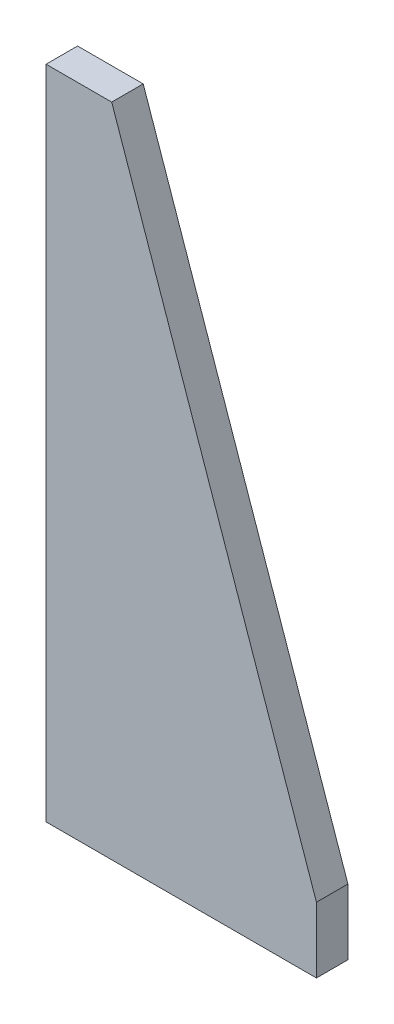
ISO-10303-21;
HEADER;
FILE_DESCRIPTION(('STEP AP214'),'2;1');
FILE_NAME('part.step','',(''),(''),'','','');
FILE_SCHEMA(('AUTOMOTIVE_DESIGN { 1 0 10303 214 1 1 1 1 }'));
ENDSEC;
DATA;
#1=APPLICATION_CONTEXT('core data for automotive mechanical design processes');
#2=APPLICATION_PROTOCOL_DEFINITION('international standard','automotive_design',2000,#1);
#3=PRODUCT_CONTEXT('',#1,'mechanical');
#4=PRODUCT('Part','Part','',(#3));
#5=PRODUCT_RELATED_PRODUCT_CATEGORY('part','',(#4));
#6=PRODUCT_DEFINITION_FORMATION('','',#4);
#7=PRODUCT_DEFINITION_CONTEXT('part definition',#1,'design');
#8=PRODUCT_DEFINITION('design','',#6,#7);
#9=PRODUCT_DEFINITION_SHAPE('','',#8);
#10=(LENGTH_UNIT() NAMED_UNIT(*) SI_UNIT(.MILLI.,.METRE.));
#11=(NAMED_UNIT(*) PLANE_ANGLE_UNIT() SI_UNIT($,.RADIAN.));
#12=(NAMED_UNIT(*) SI_UNIT($,.STERADIAN.) SOLID_ANGLE_UNIT());
#13=UNCERTAINTY_MEASURE_WITH_UNIT(LENGTH_MEASURE(1.E-05),#10,'distance_accuracy_value','');
#14=(GEOMETRIC_REPRESENTATION_CONTEXT(3) GLOBAL_UNCERTAINTY_ASSIGNED_CONTEXT((#13)) GLOBAL_UNIT_ASSIGNED_CONTEXT((#10,
#11,#12)) REPRESENTATION_CONTEXT('',''));
#15=CARTESIAN_POINT('',(0.,0.,0.));
#16=DIRECTION('',(0.,0.,1.));
#17=DIRECTION('',(1.,0.,0.));
#18=AXIS2_PLACEMENT_3D('',#15,#16,#17);
#19=CARTESIAN_POINT('',(0.,100.,-4.8));
#20=DIRECTION('',(-1.,0.,0.));
#21=DIRECTION('',(0.,-1.,0.));
#22=AXIS2_PLACEMENT_3D('',#19,#20,#21);
#23=PLANE('',#22);
#24=DIRECTION('',(0.,-1.,0.));
#25=VECTOR('',#24,1.);
#26=CARTESIAN_POINT('',(0.,100.,0.));
#27=LINE('',#26,#25);
#28=CARTESIAN_POINT('',(0.,100.,0.));
#29=VERTEX_POINT('',#28);
#30=CARTESIAN_POINT('',(0.,0.,0.));
#31=VERTEX_POINT('',#30);
#32=EDGE_CURVE('E118',#29,#31,#27,.T.);
#33=ORIENTED_EDGE('',*,*,#32,.F.);
#34=DIRECTION('',(0.,0.,1.));
#35=VECTOR('',#34,1.);
#36=CARTESIAN_POINT('',(0.,100.,-4.8));
#37=LINE('',#36,#35);
#38=CARTESIAN_POINT('',(0.,100.,-4.8));
#39=VERTEX_POINT('',#38);
#40=EDGE_CURVE('E11',#39,#29,#37,.T.);
#41=ORIENTED_EDGE('',*,*,#40,.F.);
#42=DIRECTION('',(0.,-1.,0.));
#43=VECTOR('',#42,1.);
#44=CARTESIAN_POINT('',(0.,100.,-4.8));
#45=LINE('',#44,#43);
#46=CARTESIAN_POINT('',(0.,0.,-4.8));
#47=VERTEX_POINT('',#46);
#48=EDGE_CURVE('E113',#39,#47,#45,.T.);
#49=ORIENTED_EDGE('',*,*,#48,.T.);
#50=DIRECTION('',(0.,0.,1.));
#51=VECTOR('',#50,1.);
#52=CARTESIAN_POINT('',(0.,0.,-4.8));
#53=LINE('',#52,#51);
#54=EDGE_CURVE('E44',#47,#31,#53,.T.);
#55=ORIENTED_EDGE('',*,*,#54,.T.);
#56=EDGE_LOOP('',(#33,#41,#49,#55));
#57=FACE_BOUND('',#56,.T.);
#58=ADVANCED_FACE('F41',(#57),#23,.T.);
#59=CARTESIAN_POINT('',(10.,100.,-4.8));
#60=DIRECTION('',(0.,1.,0.));
#61=DIRECTION('',(0.,0.,1.));
#62=AXIS2_PLACEMENT_3D('',#59,#60,#61);
#63=PLANE('',#62);
#64=DIRECTION('',(-1.,0.,0.));
#65=VECTOR('',#64,1.);
#66=CARTESIAN_POINT('',(10.,100.,0.));
#67=LINE('',#66,#65);
#68=CARTESIAN_POINT('',(10.,100.,0.));
#69=VERTEX_POINT('',#68);
#70=EDGE_CURVE('E127',#69,#29,#67,.T.);
#71=ORIENTED_EDGE('',*,*,#70,.F.);
#72=DIRECTION('',(0.,0.,1.));
#73=VECTOR('',#72,1.);
#74=CARTESIAN_POINT('',(10.,100.,-4.8));
#75=LINE('',#74,#73);
#76=CARTESIAN_POINT('',(10.,100.,-4.8));
#77=VERTEX_POINT('',#76);
#78=EDGE_CURVE('E50',#77,#69,#75,.T.);
#79=ORIENTED_EDGE('',*,*,#78,.F.);
#80=DIRECTION('',(-1.,0.,0.));
#81=VECTOR('',#80,1.);
#82=CARTESIAN_POINT('',(10.,100.,-4.8));
#83=LINE('',#82,#81);
#84=EDGE_CURVE('E108',#77,#39,#83,.T.);
#85=ORIENTED_EDGE('',*,*,#84,.T.);
#86=ORIENTED_EDGE('',*,*,#40,.T.);
#87=EDGE_LOOP('',(#71,#79,#85,#86));
#88=FACE_BOUND('',#87,.T.);
#89=ADVANCED_FACE('F133',(#88),#63,.T.);
#90=CARTESIAN_POINT('',(41.2,10.,-4.8));
#91=DIRECTION('',(0.944836198498626,0.327543215479524,0.));
#92=DIRECTION('',(-0.327543215479524,0.944836198498626,0.));
#93=AXIS2_PLACEMENT_3D('',#90,#91,#92);
#94=PLANE('',#93);
#95=DIRECTION('',(-0.327543215479524,0.944836198498626,0.));
#96=VECTOR('',#95,1.);
#97=CARTESIAN_POINT('',(41.2,10.,0.));
#98=LINE('',#97,#96);
#99=CARTESIAN_POINT('',(41.2,10.,0.));
#100=VERTEX_POINT('',#99);
#101=EDGE_CURVE('E97',#100,#69,#98,.T.);
#102=ORIENTED_EDGE('',*,*,#101,.F.);
#103=DIRECTION('',(0.,0.,1.));
#104=VECTOR('',#103,1.);
#105=CARTESIAN_POINT('',(41.2,10.,-4.8));
#106=LINE('',#105,#104);
#107=CARTESIAN_POINT('',(41.2,10.,-4.8));
#108=VERTEX_POINT('',#107);
#109=EDGE_CURVE('E92',#108,#100,#106,.T.);
#110=ORIENTED_EDGE('',*,*,#109,.F.);
#111=DIRECTION('',(-0.327543215479524,0.944836198498626,0.));
#112=VECTOR('',#111,1.);
#113=CARTESIAN_POINT('',(41.2,10.,-4.8));
#114=LINE('',#113,#112);
#115=EDGE_CURVE('E95',#108,#77,#114,.T.);
#116=ORIENTED_EDGE('',*,*,#115,.T.);
#117=ORIENTED_EDGE('',*,*,#78,.T.);
#118=EDGE_LOOP('',(#102,#110,#116,#117));
#119=FACE_BOUND('',#118,.T.);
#120=ADVANCED_FACE('F94',(#119),#94,.T.);
#121=CARTESIAN_POINT('',(41.2,0.,-4.8));
#122=DIRECTION('',(1.,0.,0.));
#123=DIRECTION('',(0.,0.,-1.));
#124=AXIS2_PLACEMENT_3D('',#121,#122,#123);
#125=PLANE('',#124);
#126=DIRECTION('',(0.,1.,0.));
#127=VECTOR('',#126,1.);
#128=CARTESIAN_POINT('',(41.2,0.,0.));
#129=LINE('',#128,#127);
#130=CARTESIAN_POINT('',(41.2,0.,0.));
#131=VERTEX_POINT('',#130);
#132=EDGE_CURVE('E124',#131,#100,#129,.T.);
#133=ORIENTED_EDGE('',*,*,#132,.F.);
#134=DIRECTION('',(0.,0.,1.));
#135=VECTOR('',#134,1.);
#136=CARTESIAN_POINT('',(41.2,0.,-4.8));
#137=LINE('',#136,#135);
#138=CARTESIAN_POINT('',(41.2,0.,-4.8));
#139=VERTEX_POINT('',#138);
#140=EDGE_CURVE('E102',#139,#131,#137,.T.);
#141=ORIENTED_EDGE('',*,*,#140,.F.);
#142=DIRECTION('',(0.,1.,0.));
#143=VECTOR('',#142,1.);
#144=CARTESIAN_POINT('',(41.2,0.,-4.8));
#145=LINE('',#144,#143);
#146=EDGE_CURVE('E107',#139,#108,#145,.T.);
#147=ORIENTED_EDGE('',*,*,#146,.T.);
#148=ORIENTED_EDGE('',*,*,#109,.T.);
#149=EDGE_LOOP('',(#133,#141,#147,#148));
#150=FACE_BOUND('',#149,.T.);
#151=ADVANCED_FACE('F110',(#150),#125,.T.);
#152=CARTESIAN_POINT('',(0.,0.,-4.8));
#153=DIRECTION('',(0.,-1.,0.));
#154=DIRECTION('',(0.,0.,-1.));
#155=AXIS2_PLACEMENT_3D('',#152,#153,#154);
#156=PLANE('',#155);
#157=DIRECTION('',(1.,0.,0.));
#158=VECTOR('',#157,1.);
#159=CARTESIAN_POINT('',(0.,0.,0.));
#160=LINE('',#159,#158);
#161=EDGE_CURVE('E121',#31,#131,#160,.T.);
#162=ORIENTED_EDGE('',*,*,#161,.F.);
#163=ORIENTED_EDGE('',*,*,#54,.F.);
#164=DIRECTION('',(1.,0.,0.));
#165=VECTOR('',#164,1.);
#166=CARTESIAN_POINT('',(0.,0.,-4.8));
#167=LINE('',#166,#165);
#168=EDGE_CURVE('E111',#47,#139,#167,.T.);
#169=ORIENTED_EDGE('',*,*,#168,.T.);
#170=ORIENTED_EDGE('',*,*,#140,.T.);
#171=EDGE_LOOP('',(#162,#163,#169,#170));
#172=FACE_BOUND('',#171,.T.);
#173=ADVANCED_FACE('F130',(#172),#156,.T.);
#174=CARTESIAN_POINT('',(0.,0.,-4.8));
#175=DIRECTION('',(0.,0.,1.));
#176=DIRECTION('',(1.,0.,0.));
#177=AXIS2_PLACEMENT_3D('',#174,#175,#176);
#178=PLANE('',#177);
#179=ORIENTED_EDGE('',*,*,#48,.F.);
#180=ORIENTED_EDGE('',*,*,#84,.F.);
#181=ORIENTED_EDGE('',*,*,#115,.F.);
#182=ORIENTED_EDGE('',*,*,#146,.F.);
#183=ORIENTED_EDGE('',*,*,#168,.F.);
#184=EDGE_LOOP('',(#179,#180,#181,#182,#183));
#185=FACE_BOUND('',#184,.T.);
#186=ADVANCED_FACE('F106',(#185),#178,.F.);
#187=CARTESIAN_POINT('',(0.,0.,0.));
#188=DIRECTION('',(0.,0.,1.));
#189=DIRECTION('',(1.,0.,0.));
#190=AXIS2_PLACEMENT_3D('',#187,#188,#189);
#191=PLANE('',#190);
#192=ORIENTED_EDGE('',*,*,#32,.T.);
#193=ORIENTED_EDGE('',*,*,#161,.T.);
#194=ORIENTED_EDGE('',*,*,#132,.T.);
#195=ORIENTED_EDGE('',*,*,#101,.T.);
#196=ORIENTED_EDGE('',*,*,#70,.T.);
#197=EDGE_LOOP('',(#192,#193,#194,#195,#196));
#198=FACE_BOUND('',#197,.T.);
#199=ADVANCED_FACE('F132',(#198),#191,.T.);
#200=CLOSED_SHELL('',(#58,#89,#120,#151,#173,#186,#199));
#201=MANIFOLD_SOLID_BREP('B2',#200);
#202=ADVANCED_BREP_SHAPE_REPRESENTATION('',(#18,#201),#14);
#203=SHAPE_DEFINITION_REPRESENTATION(#9,#202);
ENDSEC;
END-ISO-10303-21;
